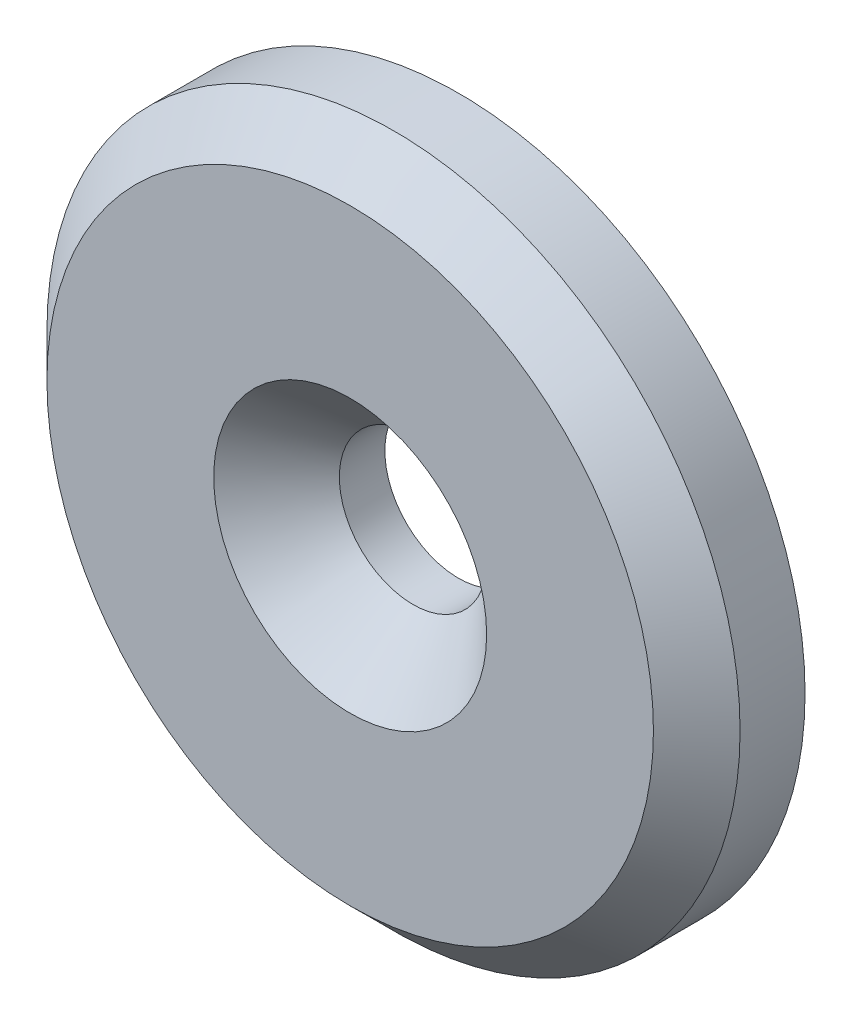
ISO-10303-21;
HEADER;
FILE_DESCRIPTION(('STEP AP214'),'2;1');
FILE_NAME('part.step','',(''),(''),'','','');
FILE_SCHEMA(('AUTOMOTIVE_DESIGN { 1 0 10303 214 1 1 1 1 }'));
ENDSEC;
DATA;
#1=APPLICATION_CONTEXT('core data for automotive mechanical design processes');
#2=APPLICATION_PROTOCOL_DEFINITION('international standard','automotive_design',2000,#1);
#3=PRODUCT_CONTEXT('',#1,'mechanical');
#4=PRODUCT('Part','Part','',(#3));
#5=PRODUCT_RELATED_PRODUCT_CATEGORY('part','',(#4));
#6=PRODUCT_DEFINITION_FORMATION('','',#4);
#7=PRODUCT_DEFINITION_CONTEXT('part definition',#1,'design');
#8=PRODUCT_DEFINITION('design','',#6,#7);
#9=PRODUCT_DEFINITION_SHAPE('','',#8);
#10=(LENGTH_UNIT() NAMED_UNIT(*) SI_UNIT(.MILLI.,.METRE.));
#11=(NAMED_UNIT(*) PLANE_ANGLE_UNIT() SI_UNIT($,.RADIAN.));
#12=(NAMED_UNIT(*) SI_UNIT($,.STERADIAN.) SOLID_ANGLE_UNIT());
#13=UNCERTAINTY_MEASURE_WITH_UNIT(LENGTH_MEASURE(1.E-05),#10,'distance_accuracy_value','');
#14=(GEOMETRIC_REPRESENTATION_CONTEXT(3) GLOBAL_UNCERTAINTY_ASSIGNED_CONTEXT((#13)) GLOBAL_UNIT_ASSIGNED_CONTEXT((#10,
#11,#12)) REPRESENTATION_CONTEXT('',''));
#15=CARTESIAN_POINT('',(0.,0.,0.));
#16=DIRECTION('',(0.,0.,1.));
#17=DIRECTION('',(1.,0.,0.));
#18=AXIS2_PLACEMENT_3D('',#15,#16,#17);
#19=CARTESIAN_POINT('',(0.,0.,2.5));
#20=DIRECTION('',(0.,0.,-1.));
#21=DIRECTION('',(-1.,0.,0.));
#22=AXIS2_PLACEMENT_3D('',#19,#20,#21);
#23=CYLINDRICAL_SURFACE('',#22,8.);
#24=CARTESIAN_POINT('',(0.,0.,1.5));
#25=DIRECTION('',(0.,0.,1.));
#26=DIRECTION('',(1.,0.,0.));
#27=AXIS2_PLACEMENT_3D('',#24,#25,#26);
#28=CIRCLE('',#27,8.);
#29=CARTESIAN_POINT('',(8.,0.,1.5));
#30=VERTEX_POINT('',#29);
#31=EDGE_CURVE('E10',#30,#30,#28,.F.);
#32=ORIENTED_EDGE('',*,*,#31,.T.);
#33=EDGE_LOOP('',(#32));
#34=FACE_BOUND('',#33,.T.);
#35=CARTESIAN_POINT('',(0.,0.,0.));
#36=DIRECTION('',(0.,0.,1.));
#37=DIRECTION('',(1.,0.,0.));
#38=AXIS2_PLACEMENT_3D('',#35,#36,#37);
#39=CIRCLE('',#38,8.);
#40=CARTESIAN_POINT('',(8.,0.,0.));
#41=VERTEX_POINT('',#40);
#42=EDGE_CURVE('E47',#41,#41,#39,.T.);
#43=ORIENTED_EDGE('',*,*,#42,.T.);
#44=EDGE_LOOP('',(#43));
#45=FACE_BOUND('',#44,.T.);
#46=ADVANCED_FACE('F35',(#34,#45),#23,.T.);
#47=CARTESIAN_POINT('',(0.,0.,2.5));
#48=DIRECTION('',(0.,0.,1.));
#49=DIRECTION('',(1.,0.,0.));
#50=AXIS2_PLACEMENT_3D('',#47,#48,#49);
#51=PLANE('',#50);
#52=CARTESIAN_POINT('',(0.,0.,2.5));
#53=DIRECTION('',(0.,0.,1.));
#54=DIRECTION('',(1.,0.,0.));
#55=AXIS2_PLACEMENT_3D('',#52,#53,#54);
#56=CIRCLE('',#55,3.15);
#57=CARTESIAN_POINT('',(3.15,0.,2.5));
#58=VERTEX_POINT('',#57);
#59=EDGE_CURVE('E59',#58,#58,#56,.T.);
#60=ORIENTED_EDGE('',*,*,#59,.F.);
#61=EDGE_LOOP('',(#60));
#62=FACE_BOUND('',#61,.T.);
#63=CARTESIAN_POINT('',(0.,0.,2.5));
#64=DIRECTION('',(0.,0.,1.));
#65=DIRECTION('',(1.,0.,0.));
#66=AXIS2_PLACEMENT_3D('',#63,#64,#65);
#67=CIRCLE('',#66,7.);
#68=CARTESIAN_POINT('',(7.,0.,2.5));
#69=VERTEX_POINT('',#68);
#70=EDGE_CURVE('E43',#69,#69,#67,.T.);
#71=ORIENTED_EDGE('',*,*,#70,.T.);
#72=EDGE_LOOP('',(#71));
#73=FACE_BOUND('',#72,.T.);
#74=ADVANCED_FACE('F65',(#62,#73),#51,.T.);
#75=CARTESIAN_POINT('',(0.,0.,0.));
#76=DIRECTION('',(0.,0.,1.));
#77=DIRECTION('',(1.,0.,0.));
#78=AXIS2_PLACEMENT_3D('',#75,#76,#77);
#79=PLANE('',#78);
#80=CARTESIAN_POINT('',(0.,0.,0.));
#81=DIRECTION('',(0.,0.,1.));
#82=DIRECTION('',(1.,0.,0.));
#83=AXIS2_PLACEMENT_3D('',#80,#81,#82);
#84=CIRCLE('',#83,1.7);
#85=CARTESIAN_POINT('',(1.7,0.,0.));
#86=VERTEX_POINT('',#85);
#87=EDGE_CURVE('E51',#86,#86,#84,.T.);
#88=ORIENTED_EDGE('',*,*,#87,.T.);
#89=EDGE_LOOP('',(#88));
#90=FACE_BOUND('',#89,.T.);
#91=ORIENTED_EDGE('',*,*,#42,.F.);
#92=EDGE_LOOP('',(#91));
#93=FACE_BOUND('',#92,.T.);
#94=ADVANCED_FACE('F67',(#90,#93),#79,.F.);
#95=CARTESIAN_POINT('',(0.,0.,2.5));
#96=DIRECTION('',(0.,0.,-1.));
#97=DIRECTION('',(-1.,0.,0.));
#98=AXIS2_PLACEMENT_3D('',#95,#96,#97);
#99=CONICAL_SURFACE('',#98,7.,0.785398163397447);
#100=ORIENTED_EDGE('',*,*,#31,.F.);
#101=EDGE_LOOP('',(#100));
#102=FACE_BOUND('',#101,.T.);
#103=ORIENTED_EDGE('',*,*,#70,.F.);
#104=EDGE_LOOP('',(#103));
#105=FACE_BOUND('',#104,.T.);
#106=ADVANCED_FACE('F38',(#102,#105),#99,.T.);
#107=CARTESIAN_POINT('',(0.,0.,2.5));
#108=DIRECTION('',(0.,0.,1.));
#109=DIRECTION('',(1.,0.,0.));
#110=AXIS2_PLACEMENT_3D('',#107,#108,#109);
#111=CYLINDRICAL_SURFACE('',#110,1.7);
#112=ORIENTED_EDGE('',*,*,#87,.F.);
#113=EDGE_LOOP('',(#112));
#114=FACE_BOUND('',#113,.T.);
#115=CARTESIAN_POINT('',(0.,0.,1.05));
#116=DIRECTION('',(0.,0.,1.));
#117=DIRECTION('',(1.,0.,0.));
#118=AXIS2_PLACEMENT_3D('',#115,#116,#117);
#119=CIRCLE('',#118,1.7);
#120=CARTESIAN_POINT('',(1.7,0.,1.05));
#121=VERTEX_POINT('',#120);
#122=EDGE_CURVE('E56',#121,#121,#119,.T.);
#123=ORIENTED_EDGE('',*,*,#122,.T.);
#124=EDGE_LOOP('',(#123));
#125=FACE_BOUND('',#124,.T.);
#126=ADVANCED_FACE('F76',(#114,#125),#111,.F.);
#127=CARTESIAN_POINT('',(0.,0.,2.5));
#128=DIRECTION('',(0.,0.,1.));
#129=DIRECTION('',(1.,0.,0.));
#130=AXIS2_PLACEMENT_3D('',#127,#128,#129);
#131=CONICAL_SURFACE('',#130,3.15,0.785398163397448);
#132=ORIENTED_EDGE('',*,*,#122,.F.);
#133=EDGE_LOOP('',(#132));
#134=FACE_BOUND('',#133,.T.);
#135=ORIENTED_EDGE('',*,*,#59,.T.);
#136=EDGE_LOOP('',(#135));
#137=FACE_BOUND('',#136,.T.);
#138=ADVANCED_FACE('F63',(#134,#137),#131,.F.);
#139=CLOSED_SHELL('',(#46,#74,#94,#106,#126,#138));
#140=MANIFOLD_SOLID_BREP('B2',#139);
#141=ADVANCED_BREP_SHAPE_REPRESENTATION('',(#18,#140),#14);
#142=SHAPE_DEFINITION_REPRESENTATION(#9,#141);
ENDSEC;
END-ISO-10303-21;
